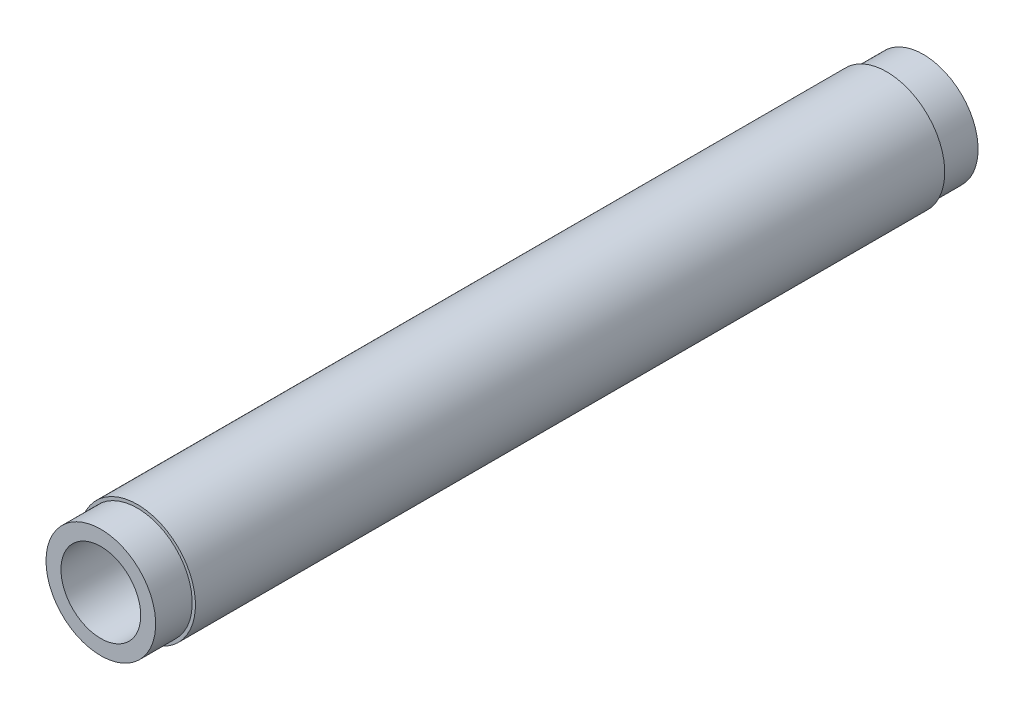
ISO-10303-21;
HEADER;
FILE_DESCRIPTION(('STEP AP214'),'2;1');
FILE_NAME('part.step','',(''),(''),'','','');
FILE_SCHEMA(('AUTOMOTIVE_DESIGN { 1 0 10303 214 1 1 1 1 }'));
ENDSEC;
DATA;
#1=APPLICATION_CONTEXT('core data for automotive mechanical design processes');
#2=APPLICATION_PROTOCOL_DEFINITION('international standard','automotive_design',2000,#1);
#3=PRODUCT_CONTEXT('',#1,'mechanical');
#4=PRODUCT('Part','Part','',(#3));
#5=PRODUCT_RELATED_PRODUCT_CATEGORY('part','',(#4));
#6=PRODUCT_DEFINITION_FORMATION('','',#4);
#7=PRODUCT_DEFINITION_CONTEXT('part definition',#1,'design');
#8=PRODUCT_DEFINITION('design','',#6,#7);
#9=PRODUCT_DEFINITION_SHAPE('','',#8);
#10=(LENGTH_UNIT() NAMED_UNIT(*) SI_UNIT(.MILLI.,.METRE.));
#11=(NAMED_UNIT(*) PLANE_ANGLE_UNIT() SI_UNIT($,.RADIAN.));
#12=(NAMED_UNIT(*) SI_UNIT($,.STERADIAN.) SOLID_ANGLE_UNIT());
#13=UNCERTAINTY_MEASURE_WITH_UNIT(LENGTH_MEASURE(1.E-05),#10,'distance_accuracy_value','');
#14=(GEOMETRIC_REPRESENTATION_CONTEXT(3) GLOBAL_UNCERTAINTY_ASSIGNED_CONTEXT((#13)) GLOBAL_UNIT_ASSIGNED_CONTEXT((#10,
#11,#12)) REPRESENTATION_CONTEXT('',''));
#15=CARTESIAN_POINT('',(0.,0.,0.));
#16=DIRECTION('',(0.,0.,1.));
#17=DIRECTION('',(1.,0.,0.));
#18=AXIS2_PLACEMENT_3D('',#15,#16,#17);
#19=CARTESIAN_POINT('',(0.,0.,45.));
#20=DIRECTION('',(0.,0.,-1.));
#21=DIRECTION('',(-1.,0.,0.));
#22=AXIS2_PLACEMENT_3D('',#19,#20,#21);
#23=CYLINDRICAL_SURFACE('',#22,6.);
#24=CARTESIAN_POINT('',(0.,0.,45.));
#25=DIRECTION('',(0.,0.,1.));
#26=DIRECTION('',(1.,0.,0.));
#27=AXIS2_PLACEMENT_3D('',#24,#25,#26);
#28=CIRCLE('',#27,6.);
#29=CARTESIAN_POINT('',(-6.,0.,45.));
#30=VERTEX_POINT('',#29);
#31=EDGE_CURVE('E39',#30,#30,#28,.T.);
#32=CARTESIAN_POINT('',(0.,0.,41.));
#33=DIRECTION('',(0.,0.,-1.));
#34=DIRECTION('',(-1.,0.,0.));
#35=AXIS2_PLACEMENT_3D('',#32,#33,#34);
#36=CIRCLE('',#35,6.);
#37=CARTESIAN_POINT('',(-6.,0.,41.));
#38=VERTEX_POINT('',#37);
#39=EDGE_CURVE('E11',#38,#38,#36,.T.);
#40=CARTESIAN_POINT('',(-6.,0.,45.));
#41=CARTESIAN_POINT('',(-6.,0.,44.9583333333333));
#42=CARTESIAN_POINT('',(-6.,0.,44.9166666666667));
#43=CARTESIAN_POINT('',(-6.,0.,44.8333333333333));
#44=CARTESIAN_POINT('',(-6.,0.,44.7916666666667));
#45=CARTESIAN_POINT('',(-6.,0.,44.7083333333333));
#46=CARTESIAN_POINT('',(-6.,0.,44.6666666666667));
#47=CARTESIAN_POINT('',(-6.,0.,44.5833333333333));
#48=CARTESIAN_POINT('',(-6.,0.,44.5416666666667));
#49=CARTESIAN_POINT('',(-6.,0.,44.4583333333333));
#50=CARTESIAN_POINT('',(-6.,0.,44.4166666666667));
#51=CARTESIAN_POINT('',(-6.,0.,44.3333333333333));
#52=CARTESIAN_POINT('',(-6.,0.,44.2916666666667));
#53=CARTESIAN_POINT('',(-6.,0.,44.2083333333333));
#54=CARTESIAN_POINT('',(-6.,0.,44.1666666666667));
#55=CARTESIAN_POINT('',(-6.,0.,44.0833333333333));
#56=CARTESIAN_POINT('',(-6.,0.,44.0416666666667));
#57=CARTESIAN_POINT('',(-6.,0.,43.9583333333333));
#58=CARTESIAN_POINT('',(-6.,0.,43.9166666666667));
#59=CARTESIAN_POINT('',(-6.,0.,43.8333333333333));
#60=CARTESIAN_POINT('',(-6.,0.,43.7916666666667));
#61=CARTESIAN_POINT('',(-6.,0.,43.7083333333333));
#62=CARTESIAN_POINT('',(-6.,0.,43.6666666666667));
#63=CARTESIAN_POINT('',(-6.,0.,43.5833333333333));
#64=CARTESIAN_POINT('',(-6.,0.,43.5416666666667));
#65=CARTESIAN_POINT('',(-6.,0.,43.4583333333333));
#66=CARTESIAN_POINT('',(-6.,0.,43.4166666666667));
#67=CARTESIAN_POINT('',(-6.,0.,43.3333333333333));
#68=CARTESIAN_POINT('',(-6.,0.,43.2916666666667));
#69=CARTESIAN_POINT('',(-6.,0.,43.2083333333333));
#70=CARTESIAN_POINT('',(-6.,0.,43.1666666666667));
#71=CARTESIAN_POINT('',(-6.,0.,43.0833333333333));
#72=CARTESIAN_POINT('',(-6.,0.,43.0416666666667));
#73=CARTESIAN_POINT('',(-6.,0.,42.9583333333333));
#74=CARTESIAN_POINT('',(-6.,0.,42.9166666666667));
#75=CARTESIAN_POINT('',(-6.,0.,42.8333333333333));
#76=CARTESIAN_POINT('',(-6.,0.,42.7916666666667));
#77=CARTESIAN_POINT('',(-6.,0.,42.7083333333333));
#78=CARTESIAN_POINT('',(-6.,0.,42.6666666666667));
#79=CARTESIAN_POINT('',(-6.,0.,42.5833333333333));
#80=CARTESIAN_POINT('',(-6.,0.,42.5416666666667));
#81=CARTESIAN_POINT('',(-6.,0.,42.4583333333333));
#82=CARTESIAN_POINT('',(-6.,0.,42.4166666666667));
#83=CARTESIAN_POINT('',(-6.,0.,42.3333333333333));
#84=CARTESIAN_POINT('',(-6.,0.,42.2916666666667));
#85=CARTESIAN_POINT('',(-6.,0.,42.2083333333333));
#86=CARTESIAN_POINT('',(-6.,0.,42.1666666666667));
#87=CARTESIAN_POINT('',(-6.,0.,42.0833333333333));
#88=CARTESIAN_POINT('',(-6.,0.,42.0416666666667));
#89=CARTESIAN_POINT('',(-6.,0.,41.9583333333333));
#90=CARTESIAN_POINT('',(-6.,0.,41.9166666666667));
#91=CARTESIAN_POINT('',(-6.,0.,41.8333333333333));
#92=CARTESIAN_POINT('',(-6.,0.,41.7916666666667));
#93=CARTESIAN_POINT('',(-6.,0.,41.7083333333333));
#94=CARTESIAN_POINT('',(-6.,0.,41.6666666666667));
#95=CARTESIAN_POINT('',(-6.,0.,41.5833333333333));
#96=CARTESIAN_POINT('',(-6.,0.,41.5416666666667));
#97=CARTESIAN_POINT('',(-6.,0.,41.4583333333333));
#98=CARTESIAN_POINT('',(-6.,0.,41.4166666666667));
#99=CARTESIAN_POINT('',(-6.,0.,41.3333333333333));
#100=CARTESIAN_POINT('',(-6.,0.,41.2916666666667));
#101=CARTESIAN_POINT('',(-6.,0.,41.2083333333333));
#102=CARTESIAN_POINT('',(-6.,0.,41.1666666666667));
#103=CARTESIAN_POINT('',(-6.,0.,41.0833333333333));
#104=CARTESIAN_POINT('',(-6.,0.,41.0416666666667));
#105=CARTESIAN_POINT('',(-6.,0.,41.));
#106=B_SPLINE_CURVE_WITH_KNOTS('',3,(#40,#41,#42,#43,#44,#45,#46,#47,#48,#49,#50,#51,#52,#53,
#54,#55,#56,#57,#58,#59,#60,#61,#62,#63,#64,#65,#66,#67,#68,#69,#70,#71,#72,#73,#74,#75,#76,#77,
#78,#79,#80,#81,#82,#83,#84,#85,#86,#87,#88,#89,#90,#91,#92,#93,#94,#95,#96,#97,#98,#99,#100,
#101,#102,#103,#104,#105),.UNSPECIFIED.,.F.,.F.,(4,2,2,2,2,2,2,2,2,2,2,2,2,2,2,2,2,2,2,2,2,2,2,
2,2,2,2,2,2,2,2,2,4),(0.,0.124999999999993,0.249999999999993,0.374999999999993,
0.499999999999994,0.624999999999994,0.749999999999994,0.874999999999994,0.999999999999994,
1.12499999999999,1.24999999999999,1.37499999999999,1.49999999999999,1.62499999999999,
1.74999999999999,1.87499999999999,1.99999999999999,2.125,2.24999999999999,2.37499999999999,
2.49999999999999,2.62499999999999,2.74999999999999,2.87499999999999,2.99999999999999,
3.12499999999999,3.24999999999999,3.37499999999999,3.49999999999999,3.62499999999999,
3.74999999999999,3.87499999999999,3.99999999999999),.UNSPECIFIED.);
#107=EDGE_CURVE('BSEAM29',#30,#38,#106,.T.);
#108=ORIENTED_EDGE('',*,*,#31,.F.);
#109=ORIENTED_EDGE('',*,*,#39,.F.);
#110=ORIENTED_EDGE('',*,*,#107,.T.);
#111=ORIENTED_EDGE('',*,*,#107,.F.);
#112=EDGE_LOOP('',(#108,#110,#109,#111));
#113=FACE_BOUND('',#112,.T.);
#114=ADVANCED_FACE('F29',(#113),#23,.T.);
#115=CARTESIAN_POINT('',(0.,0.,45.));
#116=DIRECTION('',(0.,0.,1.));
#117=DIRECTION('',(1.,0.,0.));
#118=AXIS2_PLACEMENT_3D('',#115,#116,#117);
#119=PLANE('',#118);
#120=CARTESIAN_POINT('',(0.,0.,45.));
#121=DIRECTION('',(0.,0.,1.));
#122=DIRECTION('',(1.,0.,0.));
#123=AXIS2_PLACEMENT_3D('',#120,#121,#122);
#124=CIRCLE('',#123,4.365);
#125=CARTESIAN_POINT('',(4.365,0.,45.));
#126=VERTEX_POINT('',#125);
#127=EDGE_CURVE('E57',#126,#126,#124,.T.);
#128=ORIENTED_EDGE('',*,*,#127,.F.);
#129=EDGE_LOOP('',(#128));
#130=FACE_BOUND('',#129,.T.);
#131=ORIENTED_EDGE('',*,*,#31,.T.);
#132=EDGE_LOOP('',(#131));
#133=FACE_BOUND('',#132,.T.);
#134=ADVANCED_FACE('F63',(#130,#133),#119,.T.);
#135=CARTESIAN_POINT('',(-6.65989041315899,63.9949483309612,41.));
#136=DIRECTION('',(0.,0.,-1.));
#137=DIRECTION('',(-1.,0.,0.));
#138=AXIS2_PLACEMENT_3D('',#135,#136,#137);
#139=PLANE('',#138);
#140=CARTESIAN_POINT('',(0.,0.,41.));
#141=DIRECTION('',(0.,0.,-1.));
#142=DIRECTION('',(-1.,0.,0.));
#143=AXIS2_PLACEMENT_3D('',#140,#141,#142);
#144=CIRCLE('',#143,6.35);
#145=CARTESIAN_POINT('',(-6.35,0.,41.));
#146=VERTEX_POINT('',#145);
#147=EDGE_CURVE('E48',#146,#146,#144,.T.);
#148=ORIENTED_EDGE('',*,*,#147,.F.);
#149=EDGE_LOOP('',(#148));
#150=FACE_BOUND('',#149,.T.);
#151=ORIENTED_EDGE('',*,*,#39,.T.);
#152=EDGE_LOOP('',(#151));
#153=FACE_BOUND('',#152,.T.);
#154=ADVANCED_FACE('F66',(#150,#153),#139,.F.);
#155=CARTESIAN_POINT('',(84.9137849645705,146.040079378,-41.));
#156=DIRECTION('',(0.,0.,1.));
#157=DIRECTION('',(1.,0.,0.));
#158=AXIS2_PLACEMENT_3D('',#155,#156,#157);
#159=PLANE('',#158);
#160=CARTESIAN_POINT('',(0.,0.,-41.));
#161=DIRECTION('',(0.,0.,1.));
#162=DIRECTION('',(0.,-1.,0.));
#163=AXIS2_PLACEMENT_3D('',#160,#161,#162);
#164=CIRCLE('',#163,6.35);
#165=CARTESIAN_POINT('',(0.,-6.35,-41.));
#166=VERTEX_POINT('',#165);
#167=EDGE_CURVE('E51',#166,#166,#164,.F.);
#168=ORIENTED_EDGE('',*,*,#167,.T.);
#169=EDGE_LOOP('',(#168));
#170=FACE_BOUND('',#169,.T.);
#171=CARTESIAN_POINT('',(0.,0.,-41.));
#172=DIRECTION('',(0.,0.,1.));
#173=DIRECTION('',(0.,-1.,0.));
#174=AXIS2_PLACEMENT_3D('',#171,#172,#173);
#175=CIRCLE('',#174,6.);
#176=CARTESIAN_POINT('',(-6.,0.,-41.));
#177=VERTEX_POINT('',#176);
#178=EDGE_CURVE('E35',#177,#177,#175,.T.);
#179=ORIENTED_EDGE('',*,*,#178,.T.);
#180=EDGE_LOOP('',(#179));
#181=FACE_BOUND('',#180,.T.);
#182=ADVANCED_FACE('F93',(#170,#181),#159,.F.);
#183=CARTESIAN_POINT('',(0.,0.,58.9605122421383));
#184=DIRECTION('',(0.,0.,-1.));
#185=DIRECTION('',(-1.,0.,0.));
#186=AXIS2_PLACEMENT_3D('',#183,#184,#185);
#187=CYLINDRICAL_SURFACE('',#186,6.35);
#188=ORIENTED_EDGE('',*,*,#147,.T.);
#189=EDGE_LOOP('',(#188));
#190=FACE_BOUND('',#189,.T.);
#191=ORIENTED_EDGE('',*,*,#167,.F.);
#192=EDGE_LOOP('',(#191));
#193=FACE_BOUND('',#192,.T.);
#194=ADVANCED_FACE('F85',(#190,#193),#187,.T.);
#195=CARTESIAN_POINT('',(0.,0.,-45.));
#196=DIRECTION('',(0.,0.,1.));
#197=DIRECTION('',(1.,0.,0.));
#198=AXIS2_PLACEMENT_3D('',#195,#196,#197);
#199=PLANE('',#198);
#200=CARTESIAN_POINT('',(0.,0.,-45.));
#201=DIRECTION('',(0.,0.,1.));
#202=DIRECTION('',(1.,0.,0.));
#203=AXIS2_PLACEMENT_3D('',#200,#201,#202);
#204=CIRCLE('',#203,4.365);
#205=CARTESIAN_POINT('',(4.365,0.,-45.));
#206=VERTEX_POINT('',#205);
#207=EDGE_CURVE('E54',#206,#206,#204,.T.);
#208=ORIENTED_EDGE('',*,*,#207,.T.);
#209=EDGE_LOOP('',(#208));
#210=FACE_BOUND('',#209,.T.);
#211=CARTESIAN_POINT('',(0.,0.,-45.));
#212=DIRECTION('',(0.,0.,1.));
#213=DIRECTION('',(1.,0.,0.));
#214=AXIS2_PLACEMENT_3D('',#211,#212,#213);
#215=CIRCLE('',#214,6.);
#216=CARTESIAN_POINT('',(-6.,0.,-45.));
#217=VERTEX_POINT('',#216);
#218=EDGE_CURVE('E43',#217,#217,#215,.T.);
#219=ORIENTED_EDGE('',*,*,#218,.F.);
#220=EDGE_LOOP('',(#219));
#221=FACE_BOUND('',#220,.T.);
#222=ADVANCED_FACE('F76',(#210,#221),#199,.F.);
#223=CARTESIAN_POINT('',(-6.,0.,-45.));
#224=CARTESIAN_POINT('',(-6.,0.,-44.9583333333333));
#225=CARTESIAN_POINT('',(-6.,0.,-44.9166666666667));
#226=CARTESIAN_POINT('',(-6.,0.,-44.8333333333333));
#227=CARTESIAN_POINT('',(-6.,0.,-44.7916666666667));
#228=CARTESIAN_POINT('',(-6.,0.,-44.7083333333333));
#229=CARTESIAN_POINT('',(-6.,0.,-44.6666666666667));
#230=CARTESIAN_POINT('',(-6.,0.,-44.5833333333333));
#231=CARTESIAN_POINT('',(-6.,0.,-44.5416666666667));
#232=CARTESIAN_POINT('',(-6.,0.,-44.4583333333333));
#233=CARTESIAN_POINT('',(-6.,0.,-44.4166666666667));
#234=CARTESIAN_POINT('',(-6.,0.,-44.3333333333333));
#235=CARTESIAN_POINT('',(-6.,0.,-44.2916666666667));
#236=CARTESIAN_POINT('',(-6.,0.,-44.2083333333333));
#237=CARTESIAN_POINT('',(-6.,0.,-44.1666666666667));
#238=CARTESIAN_POINT('',(-6.,0.,-44.0833333333333));
#239=CARTESIAN_POINT('',(-6.,0.,-44.0416666666667));
#240=CARTESIAN_POINT('',(-6.,0.,-43.9583333333333));
#241=CARTESIAN_POINT('',(-6.,0.,-43.9166666666667));
#242=CARTESIAN_POINT('',(-6.,0.,-43.8333333333333));
#243=CARTESIAN_POINT('',(-6.,0.,-43.7916666666667));
#244=CARTESIAN_POINT('',(-6.,0.,-43.7083333333333));
#245=CARTESIAN_POINT('',(-6.,0.,-43.6666666666667));
#246=CARTESIAN_POINT('',(-6.,0.,-43.5833333333333));
#247=CARTESIAN_POINT('',(-6.,0.,-43.5416666666667));
#248=CARTESIAN_POINT('',(-6.,0.,-43.4583333333333));
#249=CARTESIAN_POINT('',(-6.,0.,-43.4166666666667));
#250=CARTESIAN_POINT('',(-6.,0.,-43.3333333333333));
#251=CARTESIAN_POINT('',(-6.,0.,-43.2916666666667));
#252=CARTESIAN_POINT('',(-6.,0.,-43.2083333333333));
#253=CARTESIAN_POINT('',(-6.,0.,-43.1666666666667));
#254=CARTESIAN_POINT('',(-6.,0.,-43.0833333333333));
#255=CARTESIAN_POINT('',(-6.,0.,-43.0416666666667));
#256=CARTESIAN_POINT('',(-6.,0.,-42.9583333333333));
#257=CARTESIAN_POINT('',(-6.,0.,-42.9166666666667));
#258=CARTESIAN_POINT('',(-6.,0.,-42.8333333333333));
#259=CARTESIAN_POINT('',(-6.,0.,-42.7916666666667));
#260=CARTESIAN_POINT('',(-6.,0.,-42.7083333333333));
#261=CARTESIAN_POINT('',(-6.,0.,-42.6666666666667));
#262=CARTESIAN_POINT('',(-6.,0.,-42.5833333333333));
#263=CARTESIAN_POINT('',(-6.,0.,-42.5416666666667));
#264=CARTESIAN_POINT('',(-6.,0.,-42.4583333333333));
#265=CARTESIAN_POINT('',(-6.,0.,-42.4166666666667));
#266=CARTESIAN_POINT('',(-6.,0.,-42.3333333333333));
#267=CARTESIAN_POINT('',(-6.,0.,-42.2916666666667));
#268=CARTESIAN_POINT('',(-6.,0.,-42.2083333333333));
#269=CARTESIAN_POINT('',(-6.,0.,-42.1666666666667));
#270=CARTESIAN_POINT('',(-6.,0.,-42.0833333333333));
#271=CARTESIAN_POINT('',(-6.,0.,-42.0416666666667));
#272=CARTESIAN_POINT('',(-6.,0.,-41.9583333333333));
#273=CARTESIAN_POINT('',(-6.,0.,-41.9166666666667));
#274=CARTESIAN_POINT('',(-6.,0.,-41.8333333333333));
#275=CARTESIAN_POINT('',(-6.,0.,-41.7916666666667));
#276=CARTESIAN_POINT('',(-6.,0.,-41.7083333333333));
#277=CARTESIAN_POINT('',(-6.,0.,-41.6666666666667));
#278=CARTESIAN_POINT('',(-6.,0.,-41.5833333333333));
#279=CARTESIAN_POINT('',(-6.,0.,-41.5416666666667));
#280=CARTESIAN_POINT('',(-6.,0.,-41.4583333333333));
#281=CARTESIAN_POINT('',(-6.,0.,-41.4166666666667));
#282=CARTESIAN_POINT('',(-6.,0.,-41.3333333333333));
#283=CARTESIAN_POINT('',(-6.,0.,-41.2916666666667));
#284=CARTESIAN_POINT('',(-6.,0.,-41.2083333333333));
#285=CARTESIAN_POINT('',(-6.,0.,-41.1666666666667));
#286=CARTESIAN_POINT('',(-6.,0.,-41.0833333333333));
#287=CARTESIAN_POINT('',(-6.,0.,-41.0416666666667));
#288=CARTESIAN_POINT('',(-6.,0.,-41.));
#289=B_SPLINE_CURVE_WITH_KNOTS('',3,(#223,#224,#225,#226,#227,#228,#229,#230,#231,#232,#233,
#234,#235,#236,#237,#238,#239,#240,#241,#242,#243,#244,#245,#246,#247,#248,#249,#250,#251,#252,
#253,#254,#255,#256,#257,#258,#259,#260,#261,#262,#263,#264,#265,#266,#267,#268,#269,#270,#271,
#272,#273,#274,#275,#276,#277,#278,#279,#280,#281,#282,#283,#284,#285,#286,#287,#288),
.UNSPECIFIED.,.F.,.F.,(4,2,2,2,2,2,2,2,2,2,2,2,2,2,2,2,2,2,2,2,2,2,2,2,2,2,2,2,2,2,2,2,4),(0.,
0.125,0.25,0.375,0.5,0.625000000000001,0.750000000000001,0.875000000000001,1.,1.125,1.25,1.375,
1.5,1.625,1.75,1.875,2.,2.125,2.25,2.375,2.5,2.625,2.75,2.875,3.,3.125,3.25,3.375,3.5,3.625,
3.75,3.875,4.),.UNSPECIFIED.);
#290=EDGE_CURVE('BSEAM71',#217,#177,#289,.T.);
#291=ORIENTED_EDGE('',*,*,#218,.T.);
#292=ORIENTED_EDGE('',*,*,#178,.F.);
#293=ORIENTED_EDGE('',*,*,#290,.T.);
#294=ORIENTED_EDGE('',*,*,#290,.F.);
#295=EDGE_LOOP('',(#291,#293,#292,#294));
#296=FACE_BOUND('',#295,.T.);
#297=ADVANCED_FACE('F71',(#296),#23,.T.);
#298=CARTESIAN_POINT('',(0.,0.,-45.));
#299=DIRECTION('',(0.,0.,1.));
#300=DIRECTION('',(1.,0.,0.));
#301=AXIS2_PLACEMENT_3D('',#298,#299,#300);
#302=CYLINDRICAL_SURFACE('',#301,4.365);
#303=CARTESIAN_POINT('',(4.365,0.,-45.));
#304=CARTESIAN_POINT('',(4.365,0.,-44.0625));
#305=CARTESIAN_POINT('',(4.365,0.,-43.125));
#306=CARTESIAN_POINT('',(4.365,0.,-41.25));
#307=CARTESIAN_POINT('',(4.365,0.,-40.3125));
#308=CARTESIAN_POINT('',(4.365,0.,-38.4375));
#309=CARTESIAN_POINT('',(4.365,0.,-37.5));
#310=CARTESIAN_POINT('',(4.365,0.,-35.625));
#311=CARTESIAN_POINT('',(4.365,0.,-34.6875));
#312=CARTESIAN_POINT('',(4.365,0.,-32.8125));
#313=CARTESIAN_POINT('',(4.365,0.,-31.875));
#314=CARTESIAN_POINT('',(4.365,0.,-30.));
#315=CARTESIAN_POINT('',(4.365,0.,-29.0625));
#316=CARTESIAN_POINT('',(4.365,0.,-27.1875));
#317=CARTESIAN_POINT('',(4.365,0.,-26.25));
#318=CARTESIAN_POINT('',(4.365,0.,-24.375));
#319=CARTESIAN_POINT('',(4.365,0.,-23.4375));
#320=CARTESIAN_POINT('',(4.365,0.,-21.5625));
#321=CARTESIAN_POINT('',(4.365,0.,-20.625));
#322=CARTESIAN_POINT('',(4.365,0.,-18.75));
#323=CARTESIAN_POINT('',(4.365,0.,-17.8125));
#324=CARTESIAN_POINT('',(4.365,0.,-15.9375));
#325=CARTESIAN_POINT('',(4.365,0.,-15.));
#326=CARTESIAN_POINT('',(4.365,0.,-13.125));
#327=CARTESIAN_POINT('',(4.365,0.,-12.1875));
#328=CARTESIAN_POINT('',(4.365,0.,-10.3125));
#329=CARTESIAN_POINT('',(4.365,0.,-9.37500000000001));
#330=CARTESIAN_POINT('',(4.365,0.,-7.50000000000001));
#331=CARTESIAN_POINT('',(4.365,0.,-6.56250000000001));
#332=CARTESIAN_POINT('',(4.365,0.,-4.68750000000001));
#333=CARTESIAN_POINT('',(4.365,0.,-3.75000000000001));
#334=CARTESIAN_POINT('',(4.365,0.,-1.87500000000001));
#335=CARTESIAN_POINT('',(4.365,0.,-0.937500000000008));
#336=CARTESIAN_POINT('',(4.365,0.,0.937499999999994));
#337=CARTESIAN_POINT('',(4.365,0.,1.87499999999999));
#338=CARTESIAN_POINT('',(4.365,0.,3.74999999999999));
#339=CARTESIAN_POINT('',(4.365,0.,4.68749999999999));
#340=CARTESIAN_POINT('',(4.365,0.,6.56249999999999));
#341=CARTESIAN_POINT('',(4.365,0.,7.49999999999999));
#342=CARTESIAN_POINT('',(4.365,0.,9.37499999999999));
#343=CARTESIAN_POINT('',(4.365,0.,10.3125));
#344=CARTESIAN_POINT('',(4.365,0.,12.1875));
#345=CARTESIAN_POINT('',(4.365,0.,13.125));
#346=CARTESIAN_POINT('',(4.365,0.,15.));
#347=CARTESIAN_POINT('',(4.365,0.,15.9375));
#348=CARTESIAN_POINT('',(4.365,0.,17.8125));
#349=CARTESIAN_POINT('',(4.365,0.,18.75));
#350=CARTESIAN_POINT('',(4.365,0.,20.625));
#351=CARTESIAN_POINT('',(4.365,0.,21.5625));
#352=CARTESIAN_POINT('',(4.365,0.,23.4375));
#353=CARTESIAN_POINT('',(4.365,0.,24.375));
#354=CARTESIAN_POINT('',(4.365,0.,26.25));
#355=CARTESIAN_POINT('',(4.365,0.,27.1875));
#356=CARTESIAN_POINT('',(4.365,0.,29.0625));
#357=CARTESIAN_POINT('',(4.365,0.,30.));
#358=CARTESIAN_POINT('',(4.365,0.,31.875));
#359=CARTESIAN_POINT('',(4.365,0.,32.8125));
#360=CARTESIAN_POINT('',(4.365,0.,34.6875));
#361=CARTESIAN_POINT('',(4.365,0.,35.625));
#362=CARTESIAN_POINT('',(4.365,0.,37.5));
#363=CARTESIAN_POINT('',(4.365,0.,38.4375));
#364=CARTESIAN_POINT('',(4.365,0.,40.3125));
#365=CARTESIAN_POINT('',(4.365,0.,41.25));
#366=CARTESIAN_POINT('',(4.365,0.,43.125));
#367=CARTESIAN_POINT('',(4.365,0.,44.0625));
#368=CARTESIAN_POINT('',(4.365,0.,45.));
#369=B_SPLINE_CURVE_WITH_KNOTS('',3,(#303,#304,#305,#306,#307,#308,#309,#310,#311,#312,#313,
#314,#315,#316,#317,#318,#319,#320,#321,#322,#323,#324,#325,#326,#327,#328,#329,#330,#331,#332,
#333,#334,#335,#336,#337,#338,#339,#340,#341,#342,#343,#344,#345,#346,#347,#348,#349,#350,#351,
#352,#353,#354,#355,#356,#357,#358,#359,#360,#361,#362,#363,#364,#365,#366,#367,#368),
.UNSPECIFIED.,.F.,.F.,(4,2,2,2,2,2,2,2,2,2,2,2,2,2,2,2,2,2,2,2,2,2,2,2,2,2,2,2,2,2,2,2,4),(0.,
2.8125,5.625,8.43749999999999,11.25,14.0625,16.875,19.6875,22.5,25.3125,28.125,30.9375,33.75,
36.5625,39.375,42.1875,45.,47.8125,50.625,53.4375,56.25,59.0625,61.875,64.6875,67.5,70.3125,
73.125,75.9375,78.75,81.5625,84.375,87.1875,90.),.UNSPECIFIED.);
#370=EDGE_CURVE('BSEAM61',#206,#126,#369,.T.);
#371=ORIENTED_EDGE('',*,*,#207,.F.);
#372=ORIENTED_EDGE('',*,*,#127,.T.);
#373=ORIENTED_EDGE('',*,*,#370,.T.);
#374=ORIENTED_EDGE('',*,*,#370,.F.);
#375=EDGE_LOOP('',(#371,#373,#372,#374));
#376=FACE_BOUND('',#375,.T.);
#377=ADVANCED_FACE('F61',(#376),#302,.F.);
#378=CLOSED_SHELL('',(#114,#134,#154,#182,#194,#222,#297,#377));
#379=MANIFOLD_SOLID_BREP('B2',#378);
#380=ADVANCED_BREP_SHAPE_REPRESENTATION('',(#18,#379),#14);
#381=SHAPE_DEFINITION_REPRESENTATION(#9,#380);
ENDSEC;
END-ISO-10303-21;
